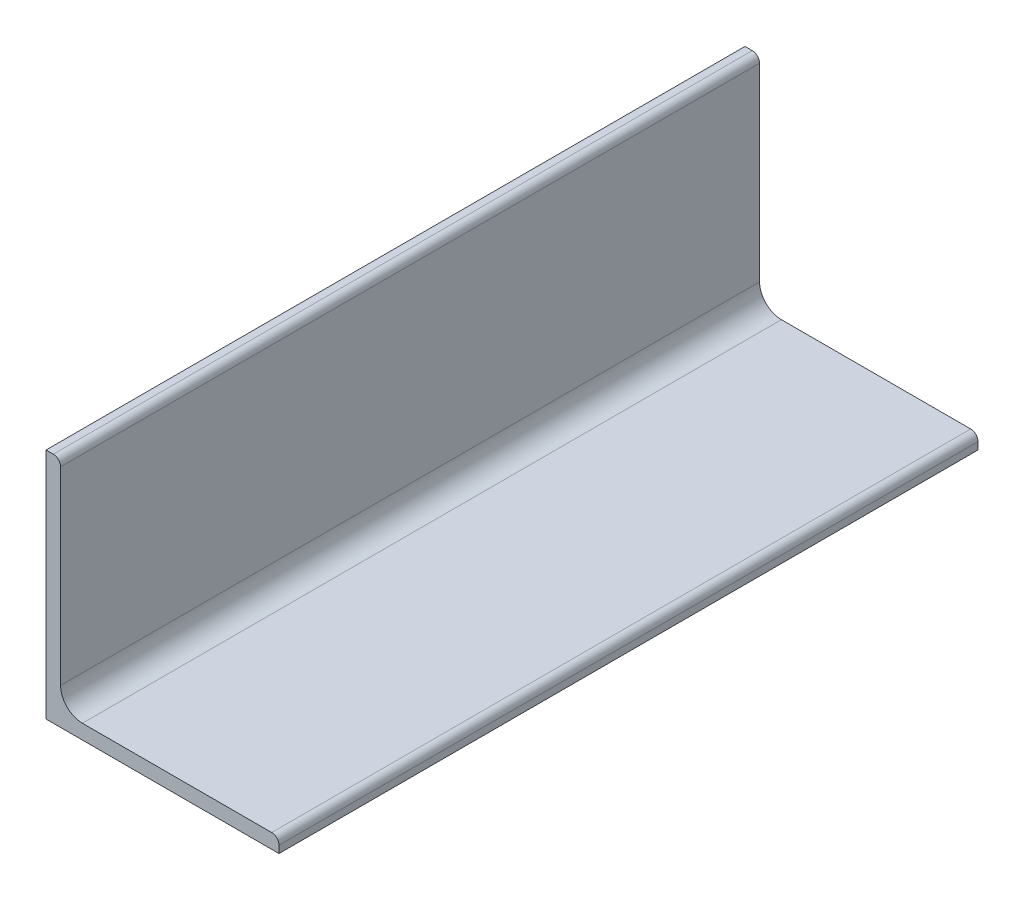
ISO-10303-21;
HEADER;
FILE_DESCRIPTION(('STEP AP214'),'2;1');
FILE_NAME('part.step','',(''),(''),'','','');
FILE_SCHEMA(('AUTOMOTIVE_DESIGN { 1 0 10303 214 1 1 1 1 }'));
ENDSEC;
DATA;
#1=APPLICATION_CONTEXT('core data for automotive mechanical design processes');
#2=APPLICATION_PROTOCOL_DEFINITION('international standard','automotive_design',2000,#1);
#3=PRODUCT_CONTEXT('',#1,'mechanical');
#4=PRODUCT('Part','Part','',(#3));
#5=PRODUCT_RELATED_PRODUCT_CATEGORY('part','',(#4));
#6=PRODUCT_DEFINITION_FORMATION('','',#4);
#7=PRODUCT_DEFINITION_CONTEXT('part definition',#1,'design');
#8=PRODUCT_DEFINITION('design','',#6,#7);
#9=PRODUCT_DEFINITION_SHAPE('','',#8);
#10=(LENGTH_UNIT() NAMED_UNIT(*) SI_UNIT(.MILLI.,.METRE.));
#11=(NAMED_UNIT(*) PLANE_ANGLE_UNIT() SI_UNIT($,.RADIAN.));
#12=(NAMED_UNIT(*) SI_UNIT($,.STERADIAN.) SOLID_ANGLE_UNIT());
#13=UNCERTAINTY_MEASURE_WITH_UNIT(LENGTH_MEASURE(1.E-05),#10,'distance_accuracy_value','');
#14=(GEOMETRIC_REPRESENTATION_CONTEXT(3) GLOBAL_UNCERTAINTY_ASSIGNED_CONTEXT((#13)) GLOBAL_UNIT_ASSIGNED_CONTEXT((#10,
#11,#12)) REPRESENTATION_CONTEXT('',''));
#15=CARTESIAN_POINT('',(0.,0.,0.));
#16=DIRECTION('',(0.,0.,1.));
#17=DIRECTION('',(1.,0.,0.));
#18=AXIS2_PLACEMENT_3D('',#15,#16,#17);
#19=CARTESIAN_POINT('',(0.865045893659089,102.172018782971,304.8));
#20=DIRECTION('',(1.,0.,0.));
#21=DIRECTION('',(0.,0.,-1.));
#22=AXIS2_PLACEMENT_3D('',#19,#20,#21);
#23=PLANE('',#22);
#24=DIRECTION('',(0.,-1.,0.));
#25=VECTOR('',#24,1.);
#26=CARTESIAN_POINT('',(0.865045893659089,102.172018782971,0.));
#27=LINE('',#26,#25);
#28=CARTESIAN_POINT('',(0.865045893659089,102.172018782971,0.));
#29=VERTEX_POINT('',#28);
#30=CARTESIAN_POINT('',(0.865045893659089,0.572018782971054,0.));
#31=VERTEX_POINT('',#30);
#32=EDGE_CURVE('E135',#29,#31,#27,.T.);
#33=ORIENTED_EDGE('',*,*,#32,.T.);
#34=DIRECTION('',(0.,0.,-1.));
#35=VECTOR('',#34,1.);
#36=CARTESIAN_POINT('',(0.865045893659089,0.572018782971054,304.8));
#37=LINE('',#36,#35);
#38=CARTESIAN_POINT('',(0.865045893659089,0.572018782971054,304.8));
#39=VERTEX_POINT('',#38);
#40=EDGE_CURVE('E11',#39,#31,#37,.T.);
#41=ORIENTED_EDGE('',*,*,#40,.F.);
#42=DIRECTION('',(0.,-1.,0.));
#43=VECTOR('',#42,1.);
#44=CARTESIAN_POINT('',(0.865045893659089,102.172018782971,304.8));
#45=LINE('',#44,#43);
#46=CARTESIAN_POINT('',(0.865045893659089,102.172018782971,304.8));
#47=VERTEX_POINT('',#46);
#48=EDGE_CURVE('E151',#47,#39,#45,.T.);
#49=ORIENTED_EDGE('',*,*,#48,.F.);
#50=DIRECTION('',(0.,0.,-1.));
#51=VECTOR('',#50,1.);
#52=CARTESIAN_POINT('',(0.865045893659089,102.172018782971,304.8));
#53=LINE('',#52,#51);
#54=EDGE_CURVE('E131',#47,#29,#53,.T.);
#55=ORIENTED_EDGE('',*,*,#54,.T.);
#56=EDGE_LOOP('',(#33,#41,#49,#55));
#57=FACE_BOUND('',#56,.T.);
#58=ADVANCED_FACE('F33',(#57),#23,.F.);
#59=CARTESIAN_POINT('',(0.865045893659089,0.572018782971054,304.8));
#60=DIRECTION('',(0.,1.,0.));
#61=DIRECTION('',(0.,0.,1.));
#62=AXIS2_PLACEMENT_3D('',#59,#60,#61);
#63=PLANE('',#62);
#64=DIRECTION('',(1.,0.,0.));
#65=VECTOR('',#64,1.);
#66=CARTESIAN_POINT('',(0.865045893659089,0.572018782971054,0.));
#67=LINE('',#66,#65);
#68=CARTESIAN_POINT('',(102.465045893659,0.572018782971054,0.));
#69=VERTEX_POINT('',#68);
#70=EDGE_CURVE('E138',#31,#69,#67,.T.);
#71=ORIENTED_EDGE('',*,*,#70,.T.);
#72=DIRECTION('',(0.,0.,-1.));
#73=VECTOR('',#72,1.);
#74=CARTESIAN_POINT('',(102.465045893659,0.572018782971054,304.8));
#75=LINE('',#74,#73);
#76=CARTESIAN_POINT('',(102.465045893659,0.572018782971054,304.8));
#77=VERTEX_POINT('',#76);
#78=EDGE_CURVE('E41',#77,#69,#75,.T.);
#79=ORIENTED_EDGE('',*,*,#78,.F.);
#80=DIRECTION('',(1.,0.,0.));
#81=VECTOR('',#80,1.);
#82=CARTESIAN_POINT('',(0.865045893659089,0.572018782971054,304.8));
#83=LINE('',#82,#81);
#84=EDGE_CURVE('E95',#39,#77,#83,.T.);
#85=ORIENTED_EDGE('',*,*,#84,.F.);
#86=ORIENTED_EDGE('',*,*,#40,.T.);
#87=EDGE_LOOP('',(#71,#79,#85,#86));
#88=FACE_BOUND('',#87,.T.);
#89=ADVANCED_FACE('F194',(#88),#63,.F.);
#90=CARTESIAN_POINT('',(102.465045893659,0.572018782971054,304.8));
#91=DIRECTION('',(-1.,0.,0.));
#92=DIRECTION('',(0.,0.,1.));
#93=AXIS2_PLACEMENT_3D('',#90,#91,#92);
#94=PLANE('',#93);
#95=DIRECTION('',(0.,1.,0.));
#96=VECTOR('',#95,1.);
#97=CARTESIAN_POINT('',(102.465045893659,0.572018782971054,0.));
#98=LINE('',#97,#96);
#99=CARTESIAN_POINT('',(102.465045893659,3.74701878297105,0.));
#100=VERTEX_POINT('',#99);
#101=EDGE_CURVE('E140',#69,#100,#98,.T.);
#102=ORIENTED_EDGE('',*,*,#101,.T.);
#103=DIRECTION('',(0.,0.,-1.));
#104=VECTOR('',#103,1.);
#105=CARTESIAN_POINT('',(102.465045893659,3.74701878297105,304.8));
#106=LINE('',#105,#104);
#107=CARTESIAN_POINT('',(102.465045893659,3.74701878297105,304.8));
#108=VERTEX_POINT('',#107);
#109=EDGE_CURVE('E161',#108,#100,#106,.T.);
#110=ORIENTED_EDGE('',*,*,#109,.F.);
#111=DIRECTION('',(0.,1.,0.));
#112=VECTOR('',#111,1.);
#113=CARTESIAN_POINT('',(102.465045893659,0.572018782971054,304.8));
#114=LINE('',#113,#112);
#115=EDGE_CURVE('E169',#77,#108,#114,.T.);
#116=ORIENTED_EDGE('',*,*,#115,.F.);
#117=ORIENTED_EDGE('',*,*,#78,.T.);
#118=EDGE_LOOP('',(#102,#110,#116,#117));
#119=FACE_BOUND('',#118,.T.);
#120=ADVANCED_FACE('F167',(#119),#94,.F.);
#121=CARTESIAN_POINT('',(99.2900458936591,3.74701878297105,304.8));
#122=DIRECTION('',(0.,0.,-1.));
#123=DIRECTION('',(-1.,0.,0.));
#124=AXIS2_PLACEMENT_3D('',#121,#122,#123);
#125=CYLINDRICAL_SURFACE('',#124,3.17500000000001);
#126=CARTESIAN_POINT('',(99.2900458936591,3.74701878297105,0.));
#127=DIRECTION('',(0.,0.,1.));
#128=DIRECTION('',(1.,0.,0.));
#129=AXIS2_PLACEMENT_3D('',#126,#127,#128);
#130=CIRCLE('',#129,3.17500000000001);
#131=CARTESIAN_POINT('',(99.2900458936591,6.92201878297106,0.));
#132=VERTEX_POINT('',#131);
#133=EDGE_CURVE('E142',#100,#132,#130,.T.);
#134=ORIENTED_EDGE('',*,*,#133,.T.);
#135=DIRECTION('',(0.,0.,-1.));
#136=VECTOR('',#135,1.);
#137=CARTESIAN_POINT('',(99.2900458936591,6.92201878297106,304.8));
#138=LINE('',#137,#136);
#139=CARTESIAN_POINT('',(99.2900458936591,6.92201878297106,304.8));
#140=VERTEX_POINT('',#139);
#141=EDGE_CURVE('E158',#140,#132,#138,.T.);
#142=ORIENTED_EDGE('',*,*,#141,.F.);
#143=CARTESIAN_POINT('',(99.2900458936591,3.74701878297105,304.8));
#144=DIRECTION('',(0.,0.,1.));
#145=DIRECTION('',(1.,0.,0.));
#146=AXIS2_PLACEMENT_3D('',#143,#144,#145);
#147=CIRCLE('',#146,3.17500000000001);
#148=EDGE_CURVE('E185',#108,#140,#147,.T.);
#149=ORIENTED_EDGE('',*,*,#148,.F.);
#150=ORIENTED_EDGE('',*,*,#109,.T.);
#151=EDGE_LOOP('',(#134,#142,#149,#150));
#152=FACE_BOUND('',#151,.T.);
#153=ADVANCED_FACE('F178',(#152),#125,.T.);
#154=CARTESIAN_POINT('',(99.2900458936591,6.92201878297105,304.8));
#155=DIRECTION('',(0.,-1.,0.));
#156=DIRECTION('',(0.,0.,-1.));
#157=AXIS2_PLACEMENT_3D('',#154,#155,#156);
#158=PLANE('',#157);
#159=DIRECTION('',(-1.,0.,0.));
#160=VECTOR('',#159,1.);
#161=CARTESIAN_POINT('',(99.2900458936591,6.92201878297105,0.));
#162=LINE('',#161,#160);
#163=CARTESIAN_POINT('',(16.7400458936591,6.92201878297105,0.));
#164=VERTEX_POINT('',#163);
#165=EDGE_CURVE('E144',#132,#164,#162,.T.);
#166=ORIENTED_EDGE('',*,*,#165,.T.);
#167=DIRECTION('',(0.,0.,-1.));
#168=VECTOR('',#167,1.);
#169=CARTESIAN_POINT('',(16.7400458936591,6.92201878297105,304.8));
#170=LINE('',#169,#168);
#171=CARTESIAN_POINT('',(16.7400458936591,6.92201878297105,304.8));
#172=VERTEX_POINT('',#171);
#173=EDGE_CURVE('E155',#172,#164,#170,.T.);
#174=ORIENTED_EDGE('',*,*,#173,.F.);
#175=DIRECTION('',(-1.,0.,0.));
#176=VECTOR('',#175,1.);
#177=CARTESIAN_POINT('',(99.2900458936591,6.92201878297105,304.8));
#178=LINE('',#177,#176);
#179=EDGE_CURVE('E184',#140,#172,#178,.T.);
#180=ORIENTED_EDGE('',*,*,#179,.F.);
#181=ORIENTED_EDGE('',*,*,#141,.T.);
#182=EDGE_LOOP('',(#166,#174,#180,#181));
#183=FACE_BOUND('',#182,.T.);
#184=ADVANCED_FACE('F182',(#183),#158,.F.);
#185=CARTESIAN_POINT('',(16.7400458936591,16.447018782971,304.8));
#186=DIRECTION('',(0.,0.,-1.));
#187=DIRECTION('',(-1.,0.,0.));
#188=AXIS2_PLACEMENT_3D('',#185,#186,#187);
#189=CYLINDRICAL_SURFACE('',#188,9.52499999999999);
#190=CARTESIAN_POINT('',(16.7400458936591,16.447018782971,0.));
#191=DIRECTION('',(0.,0.,-1.));
#192=DIRECTION('',(1.,0.,0.));
#193=AXIS2_PLACEMENT_3D('',#190,#191,#192);
#194=CIRCLE('',#193,9.52499999999999);
#195=CARTESIAN_POINT('',(7.21504589365909,16.4470187829711,0.));
#196=VERTEX_POINT('',#195);
#197=EDGE_CURVE('E146',#164,#196,#194,.T.);
#198=ORIENTED_EDGE('',*,*,#197,.T.);
#199=DIRECTION('',(0.,0.,-1.));
#200=VECTOR('',#199,1.);
#201=CARTESIAN_POINT('',(7.21504589365909,16.4470187829711,304.8));
#202=LINE('',#201,#200);
#203=CARTESIAN_POINT('',(7.21504589365909,16.4470187829711,304.8));
#204=VERTEX_POINT('',#203);
#205=EDGE_CURVE('E126',#204,#196,#202,.T.);
#206=ORIENTED_EDGE('',*,*,#205,.F.);
#207=CARTESIAN_POINT('',(16.7400458936591,16.447018782971,304.8));
#208=DIRECTION('',(0.,0.,-1.));
#209=DIRECTION('',(1.,0.,0.));
#210=AXIS2_PLACEMENT_3D('',#207,#208,#209);
#211=CIRCLE('',#210,9.52499999999999);
#212=EDGE_CURVE('E117',#172,#204,#211,.T.);
#213=ORIENTED_EDGE('',*,*,#212,.F.);
#214=ORIENTED_EDGE('',*,*,#173,.T.);
#215=EDGE_LOOP('',(#198,#206,#213,#214));
#216=FACE_BOUND('',#215,.T.);
#217=ADVANCED_FACE('F206',(#216),#189,.F.);
#218=CARTESIAN_POINT('',(7.21504589365909,16.4470187829711,304.8));
#219=DIRECTION('',(-1.,0.,0.));
#220=DIRECTION('',(0.,0.,1.));
#221=AXIS2_PLACEMENT_3D('',#218,#219,#220);
#222=PLANE('',#221);
#223=DIRECTION('',(0.,1.,0.));
#224=VECTOR('',#223,1.);
#225=CARTESIAN_POINT('',(7.21504589365909,16.4470187829711,0.));
#226=LINE('',#225,#224);
#227=CARTESIAN_POINT('',(7.21504589365909,98.9970187829711,0.));
#228=VERTEX_POINT('',#227);
#229=EDGE_CURVE('E125',#196,#228,#226,.T.);
#230=ORIENTED_EDGE('',*,*,#229,.T.);
#231=DIRECTION('',(0.,0.,-1.));
#232=VECTOR('',#231,1.);
#233=CARTESIAN_POINT('',(7.21504589365909,98.9970187829711,304.8));
#234=LINE('',#233,#232);
#235=CARTESIAN_POINT('',(7.21504589365909,98.9970187829711,304.8));
#236=VERTEX_POINT('',#235);
#237=EDGE_CURVE('E122',#236,#228,#234,.T.);
#238=ORIENTED_EDGE('',*,*,#237,.F.);
#239=DIRECTION('',(0.,1.,0.));
#240=VECTOR('',#239,1.);
#241=CARTESIAN_POINT('',(7.21504589365909,16.4470187829711,304.8));
#242=LINE('',#241,#240);
#243=EDGE_CURVE('E111',#204,#236,#242,.T.);
#244=ORIENTED_EDGE('',*,*,#243,.F.);
#245=ORIENTED_EDGE('',*,*,#205,.T.);
#246=EDGE_LOOP('',(#230,#238,#244,#245));
#247=FACE_BOUND('',#246,.T.);
#248=ADVANCED_FACE('F123',(#247),#222,.F.);
#249=CARTESIAN_POINT('',(4.04004589365909,98.997018782971,304.8));
#250=DIRECTION('',(0.,0.,-1.));
#251=DIRECTION('',(-1.,0.,0.));
#252=AXIS2_PLACEMENT_3D('',#249,#250,#251);
#253=CYLINDRICAL_SURFACE('',#252,3.175);
#254=CARTESIAN_POINT('',(4.04004589365909,98.997018782971,0.));
#255=DIRECTION('',(0.,0.,1.));
#256=DIRECTION('',(1.,0.,0.));
#257=AXIS2_PLACEMENT_3D('',#254,#255,#256);
#258=CIRCLE('',#257,3.175);
#259=CARTESIAN_POINT('',(4.04004589365909,102.172018782971,0.));
#260=VERTEX_POINT('',#259);
#261=EDGE_CURVE('E81',#228,#260,#258,.T.);
#262=ORIENTED_EDGE('',*,*,#261,.T.);
#263=DIRECTION('',(0.,0.,-1.));
#264=VECTOR('',#263,1.);
#265=CARTESIAN_POINT('',(4.04004589365909,102.172018782971,304.8));
#266=LINE('',#265,#264);
#267=CARTESIAN_POINT('',(4.04004589365909,102.172018782971,304.8));
#268=VERTEX_POINT('',#267);
#269=EDGE_CURVE('E127',#268,#260,#266,.T.);
#270=ORIENTED_EDGE('',*,*,#269,.F.);
#271=CARTESIAN_POINT('',(4.04004589365909,98.997018782971,304.8));
#272=DIRECTION('',(0.,0.,1.));
#273=DIRECTION('',(1.,0.,0.));
#274=AXIS2_PLACEMENT_3D('',#271,#272,#273);
#275=CIRCLE('',#274,3.175);
#276=EDGE_CURVE('E115',#236,#268,#275,.T.);
#277=ORIENTED_EDGE('',*,*,#276,.F.);
#278=ORIENTED_EDGE('',*,*,#237,.T.);
#279=EDGE_LOOP('',(#262,#270,#277,#278));
#280=FACE_BOUND('',#279,.T.);
#281=ADVANCED_FACE('F129',(#280),#253,.T.);
#282=CARTESIAN_POINT('',(4.04004589365909,102.172018782971,304.8));
#283=DIRECTION('',(0.,-1.,0.));
#284=DIRECTION('',(0.,0.,-1.));
#285=AXIS2_PLACEMENT_3D('',#282,#283,#284);
#286=PLANE('',#285);
#287=DIRECTION('',(-1.,0.,0.));
#288=VECTOR('',#287,1.);
#289=CARTESIAN_POINT('',(4.04004589365909,102.172018782971,0.));
#290=LINE('',#289,#288);
#291=EDGE_CURVE('E87',#260,#29,#290,.T.);
#292=ORIENTED_EDGE('',*,*,#291,.T.);
#293=ORIENTED_EDGE('',*,*,#54,.F.);
#294=DIRECTION('',(-1.,0.,0.));
#295=VECTOR('',#294,1.);
#296=CARTESIAN_POINT('',(4.04004589365909,102.172018782971,304.8));
#297=LINE('',#296,#295);
#298=EDGE_CURVE('E49',#268,#47,#297,.T.);
#299=ORIENTED_EDGE('',*,*,#298,.F.);
#300=ORIENTED_EDGE('',*,*,#269,.T.);
#301=EDGE_LOOP('',(#292,#293,#299,#300));
#302=FACE_BOUND('',#301,.T.);
#303=ADVANCED_FACE('F214',(#302),#286,.F.);
#304=CARTESIAN_POINT('',(99.2900458936591,3.74701878297105,304.8));
#305=DIRECTION('',(0.,0.,1.));
#306=DIRECTION('',(1.,0.,0.));
#307=AXIS2_PLACEMENT_3D('',#304,#305,#306);
#308=PLANE('',#307);
#309=ORIENTED_EDGE('',*,*,#48,.T.);
#310=ORIENTED_EDGE('',*,*,#84,.T.);
#311=ORIENTED_EDGE('',*,*,#115,.T.);
#312=ORIENTED_EDGE('',*,*,#148,.T.);
#313=ORIENTED_EDGE('',*,*,#179,.T.);
#314=ORIENTED_EDGE('',*,*,#212,.T.);
#315=ORIENTED_EDGE('',*,*,#243,.T.);
#316=ORIENTED_EDGE('',*,*,#276,.T.);
#317=ORIENTED_EDGE('',*,*,#298,.T.);
#318=EDGE_LOOP('',(#309,#310,#311,#312,#313,#314,#315,#316,#317));
#319=FACE_BOUND('',#318,.T.);
#320=ADVANCED_FACE('F113',(#319),#308,.T.);
#321=CARTESIAN_POINT('',(99.2900458936591,3.74701878297105,0.));
#322=DIRECTION('',(0.,0.,1.));
#323=DIRECTION('',(1.,0.,0.));
#324=AXIS2_PLACEMENT_3D('',#321,#322,#323);
#325=PLANE('',#324);
#326=ORIENTED_EDGE('',*,*,#32,.F.);
#327=ORIENTED_EDGE('',*,*,#291,.F.);
#328=ORIENTED_EDGE('',*,*,#261,.F.);
#329=ORIENTED_EDGE('',*,*,#229,.F.);
#330=ORIENTED_EDGE('',*,*,#197,.F.);
#331=ORIENTED_EDGE('',*,*,#165,.F.);
#332=ORIENTED_EDGE('',*,*,#133,.F.);
#333=ORIENTED_EDGE('',*,*,#101,.F.);
#334=ORIENTED_EDGE('',*,*,#70,.F.);
#335=EDGE_LOOP('',(#326,#327,#328,#329,#330,#331,#332,#333,#334));
#336=FACE_BOUND('',#335,.T.);
#337=ADVANCED_FACE('F173',(#336),#325,.F.);
#338=CLOSED_SHELL('',(#58,#89,#120,#153,#184,#217,#248,#281,#303,#320,#337));
#339=MANIFOLD_SOLID_BREP('B2',#338);
#340=ADVANCED_BREP_SHAPE_REPRESENTATION('',(#18,#339),#14);
#341=SHAPE_DEFINITION_REPRESENTATION(#9,#340);
ENDSEC;
END-ISO-10303-21;
